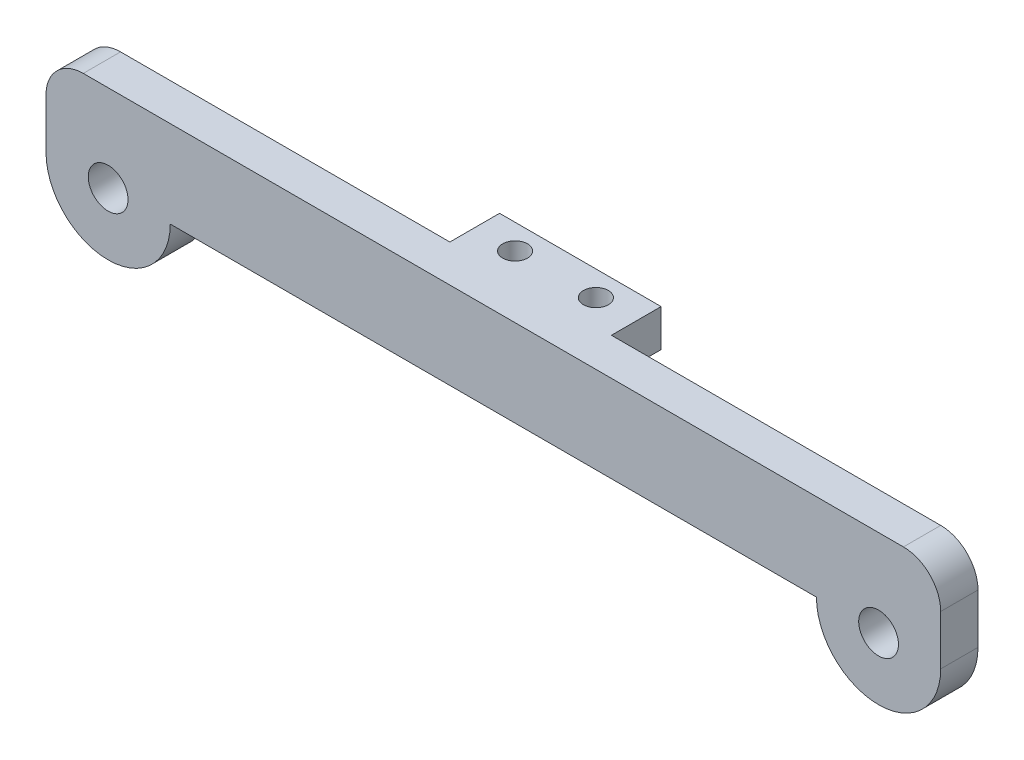
ISO-10303-21;
HEADER;
FILE_DESCRIPTION(('STEP AP214'),'2;1');
FILE_NAME('part.step','',(''),(''),'','','');
FILE_SCHEMA(('AUTOMOTIVE_DESIGN { 1 0 10303 214 1 1 1 1 }'));
ENDSEC;
DATA;
#1=APPLICATION_CONTEXT('core data for automotive mechanical design processes');
#2=APPLICATION_PROTOCOL_DEFINITION('international standard','automotive_design',2000,#1);
#3=PRODUCT_CONTEXT('',#1,'mechanical');
#4=PRODUCT('Part','Part','',(#3));
#5=PRODUCT_RELATED_PRODUCT_CATEGORY('part','',(#4));
#6=PRODUCT_DEFINITION_FORMATION('','',#4);
#7=PRODUCT_DEFINITION_CONTEXT('part definition',#1,'design');
#8=PRODUCT_DEFINITION('design','',#6,#7);
#9=PRODUCT_DEFINITION_SHAPE('','',#8);
#10=(LENGTH_UNIT() NAMED_UNIT(*) SI_UNIT(.MILLI.,.METRE.));
#11=(NAMED_UNIT(*) PLANE_ANGLE_UNIT() SI_UNIT($,.RADIAN.));
#12=(NAMED_UNIT(*) SI_UNIT($,.STERADIAN.) SOLID_ANGLE_UNIT());
#13=UNCERTAINTY_MEASURE_WITH_UNIT(LENGTH_MEASURE(1.E-05),#10,'distance_accuracy_value','');
#14=(GEOMETRIC_REPRESENTATION_CONTEXT(3) GLOBAL_UNCERTAINTY_ASSIGNED_CONTEXT((#13)) GLOBAL_UNIT_ASSIGNED_CONTEXT((#10,
#11,#12)) REPRESENTATION_CONTEXT('',''));
#15=CARTESIAN_POINT('',(0.,0.,0.));
#16=DIRECTION('',(0.,0.,1.));
#17=DIRECTION('',(1.,0.,0.));
#18=AXIS2_PLACEMENT_3D('',#15,#16,#17);
#19=CARTESIAN_POINT('',(-31.,0.,0.));
#20=DIRECTION('',(0.,0.,1.));
#21=DIRECTION('',(1.,0.,0.));
#22=AXIS2_PLACEMENT_3D('',#19,#20,#21);
#23=PLANE('',#22);
#24=CARTESIAN_POINT('',(31.,0.,0.));
#25=DIRECTION('',(0.,0.,1.));
#26=DIRECTION('',(1.,0.,0.));
#27=AXIS2_PLACEMENT_3D('',#24,#25,#26);
#28=CIRCLE('',#27,1.60000000000001);
#29=CARTESIAN_POINT('',(32.6,0.,0.));
#30=VERTEX_POINT('',#29);
#31=EDGE_CURVE('E186',#30,#30,#28,.T.);
#32=ORIENTED_EDGE('',*,*,#31,.T.);
#33=EDGE_LOOP('',(#32));
#34=FACE_BOUND('',#33,.T.);
#35=CARTESIAN_POINT('',(-31.,0.,0.));
#36=DIRECTION('',(0.,0.,1.));
#37=DIRECTION('',(1.,0.,0.));
#38=AXIS2_PLACEMENT_3D('',#35,#36,#37);
#39=CIRCLE('',#38,1.6);
#40=CARTESIAN_POINT('',(-29.4,0.,0.));
#41=VERTEX_POINT('',#40);
#42=EDGE_CURVE('E196',#41,#41,#39,.T.);
#43=ORIENTED_EDGE('',*,*,#42,.T.);
#44=EDGE_LOOP('',(#43));
#45=FACE_BOUND('',#44,.T.);
#46=DIRECTION('',(0.,-1.,0.));
#47=VECTOR('',#46,1.);
#48=CARTESIAN_POINT('',(-36.,0.,0.));
#49=LINE('',#48,#47);
#50=CARTESIAN_POINT('',(-36.,4.00000000000001,0.));
#51=VERTEX_POINT('',#50);
#52=CARTESIAN_POINT('',(-36.,0.,0.));
#53=VERTEX_POINT('',#52);
#54=EDGE_CURVE('E213',#51,#53,#49,.T.);
#55=ORIENTED_EDGE('',*,*,#54,.F.);
#56=CARTESIAN_POINT('',(-33.,4.00000000000001,0.));
#57=DIRECTION('',(0.,0.,1.));
#58=DIRECTION('',(1.,0.,0.));
#59=AXIS2_PLACEMENT_3D('',#56,#57,#58);
#60=CIRCLE('',#59,3.);
#61=CARTESIAN_POINT('',(-33.,7.00000000000001,0.));
#62=VERTEX_POINT('',#61);
#63=EDGE_CURVE('E269',#51,#62,#60,.F.);
#64=ORIENTED_EDGE('',*,*,#63,.T.);
#65=DIRECTION('',(-1.,0.,0.));
#66=VECTOR('',#65,1.);
#67=CARTESIAN_POINT('',(-36.,7.00000000000001,0.));
#68=LINE('',#67,#66);
#69=CARTESIAN_POINT('',(-6.5,7.00000000000002,0.));
#70=VERTEX_POINT('',#69);
#71=EDGE_CURVE('E241',#70,#62,#68,.T.);
#72=ORIENTED_EDGE('',*,*,#71,.F.);
#73=DIRECTION('',(0.,1.,0.));
#74=VECTOR('',#73,1.);
#75=CARTESIAN_POINT('',(-6.5,4.00000000000002,0.));
#76=LINE('',#75,#74);
#77=CARTESIAN_POINT('',(-6.5,4.00000000000002,0.));
#78=VERTEX_POINT('',#77);
#79=EDGE_CURVE('E187',#78,#70,#76,.T.);
#80=ORIENTED_EDGE('',*,*,#79,.F.);
#81=DIRECTION('',(1.,0.,0.));
#82=VECTOR('',#81,1.);
#83=CARTESIAN_POINT('',(-6.5,4.00000000000002,0.));
#84=LINE('',#83,#82);
#85=CARTESIAN_POINT('',(6.5,4.00000000000002,0.));
#86=VERTEX_POINT('',#85);
#87=EDGE_CURVE('E149',#78,#86,#84,.T.);
#88=ORIENTED_EDGE('',*,*,#87,.T.);
#89=DIRECTION('',(0.,1.,0.));
#90=VECTOR('',#89,1.);
#91=CARTESIAN_POINT('',(6.5,4.00000000000002,0.));
#92=LINE('',#91,#90);
#93=CARTESIAN_POINT('',(6.5,7.00000000000002,0.));
#94=VERTEX_POINT('',#93);
#95=EDGE_CURVE('E163',#86,#94,#92,.T.);
#96=ORIENTED_EDGE('',*,*,#95,.T.);
#97=CARTESIAN_POINT('',(33.,7.00000000000002,0.));
#98=VERTEX_POINT('',#97);
#99=EDGE_CURVE('E242',#98,#94,#68,.T.);
#100=ORIENTED_EDGE('',*,*,#99,.F.);
#101=CARTESIAN_POINT('',(33.,4.00000000000002,0.));
#102=DIRECTION('',(0.,0.,1.));
#103=DIRECTION('',(1.,0.,0.));
#104=AXIS2_PLACEMENT_3D('',#101,#102,#103);
#105=CIRCLE('',#104,3.);
#106=CARTESIAN_POINT('',(36.,4.00000000000002,0.));
#107=VERTEX_POINT('',#106);
#108=EDGE_CURVE('E266',#98,#107,#105,.F.);
#109=ORIENTED_EDGE('',*,*,#108,.T.);
#110=DIRECTION('',(0.,1.,0.));
#111=VECTOR('',#110,1.);
#112=CARTESIAN_POINT('',(36.,7.00000000000002,0.));
#113=LINE('',#112,#111);
#114=CARTESIAN_POINT('',(36.,0.,0.));
#115=VERTEX_POINT('',#114);
#116=EDGE_CURVE('E238',#115,#107,#113,.T.);
#117=ORIENTED_EDGE('',*,*,#116,.F.);
#118=CARTESIAN_POINT('',(31.,0.,0.));
#119=DIRECTION('',(0.,0.,1.));
#120=DIRECTION('',(1.,0.,0.));
#121=AXIS2_PLACEMENT_3D('',#118,#119,#120);
#122=CIRCLE('',#121,5.);
#123=CARTESIAN_POINT('',(26.,0.,0.));
#124=VERTEX_POINT('',#123);
#125=EDGE_CURVE('E235',#124,#115,#122,.T.);
#126=ORIENTED_EDGE('',*,*,#125,.F.);
#127=DIRECTION('',(1.,0.,0.));
#128=VECTOR('',#127,1.);
#129=CARTESIAN_POINT('',(-26.,0.,0.));
#130=LINE('',#129,#128);
#131=CARTESIAN_POINT('',(-26.,0.,0.));
#132=VERTEX_POINT('',#131);
#133=EDGE_CURVE('E232',#132,#124,#130,.T.);
#134=ORIENTED_EDGE('',*,*,#133,.F.);
#135=CARTESIAN_POINT('',(-31.,0.,0.));
#136=DIRECTION('',(0.,0.,1.));
#137=DIRECTION('',(1.,0.,0.));
#138=AXIS2_PLACEMENT_3D('',#135,#136,#137);
#139=CIRCLE('',#138,5.);
#140=EDGE_CURVE('E204',#53,#132,#139,.T.);
#141=ORIENTED_EDGE('',*,*,#140,.F.);
#142=EDGE_LOOP('',(#55,#64,#72,#80,#88,#96,#100,#109,#117,#126,#134,#141));
#143=FACE_BOUND('',#142,.T.);
#144=ADVANCED_FACE('F45',(#34,#45,#143),#23,.F.);
#145=CARTESIAN_POINT('',(-31.,0.,3.));
#146=DIRECTION('',(0.,0.,1.));
#147=DIRECTION('',(1.,0.,0.));
#148=AXIS2_PLACEMENT_3D('',#145,#146,#147);
#149=PLANE('',#148);
#150=CARTESIAN_POINT('',(-31.,0.,3.));
#151=DIRECTION('',(0.,0.,1.));
#152=DIRECTION('',(1.,0.,0.));
#153=AXIS2_PLACEMENT_3D('',#150,#151,#152);
#154=CIRCLE('',#153,1.6);
#155=CARTESIAN_POINT('',(-29.4,0.,3.));
#156=VERTEX_POINT('',#155);
#157=EDGE_CURVE('E200',#156,#156,#154,.T.);
#158=ORIENTED_EDGE('',*,*,#157,.F.);
#159=EDGE_LOOP('',(#158));
#160=FACE_BOUND('',#159,.T.);
#161=DIRECTION('',(-1.,0.,0.));
#162=VECTOR('',#161,1.);
#163=CARTESIAN_POINT('',(-36.,7.00000000000001,3.));
#164=LINE('',#163,#162);
#165=CARTESIAN_POINT('',(33.,7.00000000000002,3.));
#166=VERTEX_POINT('',#165);
#167=CARTESIAN_POINT('',(-33.,7.00000000000001,3.));
#168=VERTEX_POINT('',#167);
#169=EDGE_CURVE('E222',#166,#168,#164,.T.);
#170=ORIENTED_EDGE('',*,*,#169,.T.);
#171=CARTESIAN_POINT('',(-33.,4.00000000000001,3.));
#172=DIRECTION('',(0.,0.,1.));
#173=DIRECTION('',(1.,0.,0.));
#174=AXIS2_PLACEMENT_3D('',#171,#172,#173);
#175=CIRCLE('',#174,3.);
#176=CARTESIAN_POINT('',(-36.,4.00000000000001,3.));
#177=VERTEX_POINT('',#176);
#178=EDGE_CURVE('E54',#168,#177,#175,.T.);
#179=ORIENTED_EDGE('',*,*,#178,.T.);
#180=DIRECTION('',(0.,-1.,0.));
#181=VECTOR('',#180,1.);
#182=CARTESIAN_POINT('',(-36.,0.,3.));
#183=LINE('',#182,#181);
#184=CARTESIAN_POINT('',(-36.,0.,3.));
#185=VERTEX_POINT('',#184);
#186=EDGE_CURVE('E225',#177,#185,#183,.T.);
#187=ORIENTED_EDGE('',*,*,#186,.T.);
#188=CARTESIAN_POINT('',(-31.,0.,3.));
#189=DIRECTION('',(0.,0.,1.));
#190=DIRECTION('',(1.,0.,0.));
#191=AXIS2_PLACEMENT_3D('',#188,#189,#190);
#192=CIRCLE('',#191,5.);
#193=CARTESIAN_POINT('',(-26.,0.,3.));
#194=VERTEX_POINT('',#193);
#195=EDGE_CURVE('E208',#185,#194,#192,.T.);
#196=ORIENTED_EDGE('',*,*,#195,.T.);
#197=DIRECTION('',(1.,0.,0.));
#198=VECTOR('',#197,1.);
#199=CARTESIAN_POINT('',(-26.,0.,3.));
#200=LINE('',#199,#198);
#201=CARTESIAN_POINT('',(26.,0.,3.));
#202=VERTEX_POINT('',#201);
#203=EDGE_CURVE('E212',#194,#202,#200,.T.);
#204=ORIENTED_EDGE('',*,*,#203,.T.);
#205=CARTESIAN_POINT('',(31.,0.,3.));
#206=DIRECTION('',(0.,0.,1.));
#207=DIRECTION('',(1.,0.,0.));
#208=AXIS2_PLACEMENT_3D('',#205,#206,#207);
#209=CIRCLE('',#208,5.);
#210=CARTESIAN_POINT('',(36.,0.,3.));
#211=VERTEX_POINT('',#210);
#212=EDGE_CURVE('E216',#202,#211,#209,.T.);
#213=ORIENTED_EDGE('',*,*,#212,.T.);
#214=DIRECTION('',(0.,1.,0.));
#215=VECTOR('',#214,1.);
#216=CARTESIAN_POINT('',(36.,7.00000000000002,3.));
#217=LINE('',#216,#215);
#218=CARTESIAN_POINT('',(36.,4.00000000000002,3.));
#219=VERTEX_POINT('',#218);
#220=EDGE_CURVE('E219',#211,#219,#217,.T.);
#221=ORIENTED_EDGE('',*,*,#220,.T.);
#222=CARTESIAN_POINT('',(33.,4.00000000000002,3.));
#223=DIRECTION('',(0.,0.,1.));
#224=DIRECTION('',(1.,0.,0.));
#225=AXIS2_PLACEMENT_3D('',#222,#223,#224);
#226=CIRCLE('',#225,3.);
#227=EDGE_CURVE('E278',#219,#166,#226,.T.);
#228=ORIENTED_EDGE('',*,*,#227,.T.);
#229=EDGE_LOOP('',(#170,#179,#187,#196,#204,#213,#221,#228));
#230=FACE_BOUND('',#229,.T.);
#231=CARTESIAN_POINT('',(31.,0.,3.));
#232=DIRECTION('',(0.,0.,1.));
#233=DIRECTION('',(1.,0.,0.));
#234=AXIS2_PLACEMENT_3D('',#231,#232,#233);
#235=CIRCLE('',#234,1.60000000000001);
#236=CARTESIAN_POINT('',(32.6,0.,3.));
#237=VERTEX_POINT('',#236);
#238=EDGE_CURVE('E192',#237,#237,#235,.T.);
#239=ORIENTED_EDGE('',*,*,#238,.F.);
#240=EDGE_LOOP('',(#239));
#241=FACE_BOUND('',#240,.T.);
#242=ADVANCED_FACE('F284',(#160,#230,#241),#149,.T.);
#243=CARTESIAN_POINT('',(-31.,0.,3.));
#244=DIRECTION('',(0.,0.,-1.));
#245=DIRECTION('',(-1.,0.,0.));
#246=AXIS2_PLACEMENT_3D('',#243,#244,#245);
#247=CYLINDRICAL_SURFACE('',#246,5.);
#248=ORIENTED_EDGE('',*,*,#140,.T.);
#249=DIRECTION('',(0.,0.,-1.));
#250=VECTOR('',#249,1.);
#251=CARTESIAN_POINT('',(-26.,0.,3.));
#252=LINE('',#251,#250);
#253=EDGE_CURVE('E258',#194,#132,#252,.T.);
#254=ORIENTED_EDGE('',*,*,#253,.F.);
#255=ORIENTED_EDGE('',*,*,#195,.F.);
#256=DIRECTION('',(0.,0.,-1.));
#257=VECTOR('',#256,1.);
#258=CARTESIAN_POINT('',(-36.,0.,3.));
#259=LINE('',#258,#257);
#260=EDGE_CURVE('E228',#185,#53,#259,.T.);
#261=ORIENTED_EDGE('',*,*,#260,.T.);
#262=EDGE_LOOP('',(#248,#254,#255,#261));
#263=FACE_BOUND('',#262,.T.);
#264=ADVANCED_FACE('F320',(#263),#247,.T.);
#265=CARTESIAN_POINT('',(-26.,0.,3.));
#266=DIRECTION('',(0.,1.,0.));
#267=DIRECTION('',(-1.,0.,0.));
#268=AXIS2_PLACEMENT_3D('',#265,#266,#267);
#269=PLANE('',#268);
#270=ORIENTED_EDGE('',*,*,#133,.T.);
#271=DIRECTION('',(0.,0.,-1.));
#272=VECTOR('',#271,1.);
#273=CARTESIAN_POINT('',(26.,0.,3.));
#274=LINE('',#273,#272);
#275=EDGE_CURVE('E254',#202,#124,#274,.T.);
#276=ORIENTED_EDGE('',*,*,#275,.F.);
#277=ORIENTED_EDGE('',*,*,#203,.F.);
#278=ORIENTED_EDGE('',*,*,#253,.T.);
#279=EDGE_LOOP('',(#270,#276,#277,#278));
#280=FACE_BOUND('',#279,.T.);
#281=ADVANCED_FACE('F317',(#280),#269,.F.);
#282=CARTESIAN_POINT('',(31.,0.,3.));
#283=DIRECTION('',(0.,0.,-1.));
#284=DIRECTION('',(-1.,0.,0.));
#285=AXIS2_PLACEMENT_3D('',#282,#283,#284);
#286=CYLINDRICAL_SURFACE('',#285,5.);
#287=ORIENTED_EDGE('',*,*,#125,.T.);
#288=DIRECTION('',(0.,0.,-1.));
#289=VECTOR('',#288,1.);
#290=CARTESIAN_POINT('',(36.,0.,3.));
#291=LINE('',#290,#289);
#292=EDGE_CURVE('E250',#211,#115,#291,.T.);
#293=ORIENTED_EDGE('',*,*,#292,.F.);
#294=ORIENTED_EDGE('',*,*,#212,.F.);
#295=ORIENTED_EDGE('',*,*,#275,.T.);
#296=EDGE_LOOP('',(#287,#293,#294,#295));
#297=FACE_BOUND('',#296,.T.);
#298=ADVANCED_FACE('F314',(#297),#286,.T.);
#299=CARTESIAN_POINT('',(36.,7.00000000000002,3.));
#300=DIRECTION('',(-1.,0.,0.));
#301=DIRECTION('',(0.,0.,1.));
#302=AXIS2_PLACEMENT_3D('',#299,#300,#301);
#303=PLANE('',#302);
#304=ORIENTED_EDGE('',*,*,#116,.T.);
#305=DIRECTION('',(0.,0.,-1.));
#306=VECTOR('',#305,1.);
#307=CARTESIAN_POINT('',(36.,4.00000000000002,3.));
#308=LINE('',#307,#306);
#309=EDGE_CURVE('E11',#107,#219,#308,.F.);
#310=ORIENTED_EDGE('',*,*,#309,.T.);
#311=ORIENTED_EDGE('',*,*,#220,.F.);
#312=ORIENTED_EDGE('',*,*,#292,.T.);
#313=EDGE_LOOP('',(#304,#310,#311,#312));
#314=FACE_BOUND('',#313,.T.);
#315=ADVANCED_FACE('F311',(#314),#303,.F.);
#316=CARTESIAN_POINT('',(-36.,7.00000000000001,3.));
#317=DIRECTION('',(0.,-1.,0.));
#318=DIRECTION('',(1.,0.,0.));
#319=AXIS2_PLACEMENT_3D('',#316,#317,#318);
#320=PLANE('',#319);
#321=ORIENTED_EDGE('',*,*,#71,.T.);
#322=DIRECTION('',(0.,0.,-1.));
#323=VECTOR('',#322,1.);
#324=CARTESIAN_POINT('',(-33.,7.00000000000001,3.));
#325=LINE('',#324,#323);
#326=EDGE_CURVE('E67',#62,#168,#325,.F.);
#327=ORIENTED_EDGE('',*,*,#326,.T.);
#328=ORIENTED_EDGE('',*,*,#169,.F.);
#329=DIRECTION('',(0.,0.,-1.));
#330=VECTOR('',#329,1.);
#331=CARTESIAN_POINT('',(33.,7.00000000000002,3.));
#332=LINE('',#331,#330);
#333=EDGE_CURVE('E272',#166,#98,#332,.T.);
#334=ORIENTED_EDGE('',*,*,#333,.T.);
#335=ORIENTED_EDGE('',*,*,#99,.T.);
#336=DIRECTION('',(0.,0.,-1.));
#337=VECTOR('',#336,1.);
#338=CARTESIAN_POINT('',(6.5,7.00000000000002,-4.));
#339=LINE('',#338,#337);
#340=CARTESIAN_POINT('',(6.5,7.00000000000002,-4.));
#341=VERTEX_POINT('',#340);
#342=EDGE_CURVE('E178',#94,#341,#339,.T.);
#343=ORIENTED_EDGE('',*,*,#342,.T.);
#344=DIRECTION('',(-1.,0.,0.));
#345=VECTOR('',#344,1.);
#346=CARTESIAN_POINT('',(-6.5,7.00000000000002,-4.));
#347=LINE('',#346,#345);
#348=CARTESIAN_POINT('',(-6.5,7.00000000000002,-4.));
#349=VERTEX_POINT('',#348);
#350=EDGE_CURVE('E142',#341,#349,#347,.T.);
#351=ORIENTED_EDGE('',*,*,#350,.T.);
#352=DIRECTION('',(0.,0.,1.));
#353=VECTOR('',#352,1.);
#354=CARTESIAN_POINT('',(-6.5,7.00000000000002,-4.));
#355=LINE('',#354,#353);
#356=EDGE_CURVE('E165',#349,#70,#355,.T.);
#357=ORIENTED_EDGE('',*,*,#356,.T.);
#358=EDGE_LOOP('',(#321,#327,#328,#334,#335,#343,#351,#357));
#359=FACE_BOUND('',#358,.T.);
#360=CARTESIAN_POINT('',(3.25,7.00000000000002,-2.));
#361=DIRECTION('',(0.,1.,0.));
#362=DIRECTION('',(-1.,0.,0.));
#363=AXIS2_PLACEMENT_3D('',#360,#361,#362);
#364=CIRCLE('',#363,1.);
#365=CARTESIAN_POINT('',(2.25,7.00000000000002,-2.));
#366=VERTEX_POINT('',#365);
#367=EDGE_CURVE('E484',#366,#366,#364,.T.);
#368=ORIENTED_EDGE('',*,*,#367,.F.);
#369=EDGE_LOOP('',(#368));
#370=FACE_BOUND('',#369,.T.);
#371=CARTESIAN_POINT('',(-3.25,7.00000000000002,-2.));
#372=DIRECTION('',(0.,1.,0.));
#373=DIRECTION('',(-1.,0.,0.));
#374=AXIS2_PLACEMENT_3D('',#371,#372,#373);
#375=CIRCLE('',#374,1.);
#376=CARTESIAN_POINT('',(-4.25,7.00000000000002,-2.));
#377=VERTEX_POINT('',#376);
#378=EDGE_CURVE('E171',#377,#377,#375,.T.);
#379=ORIENTED_EDGE('',*,*,#378,.F.);
#380=EDGE_LOOP('',(#379));
#381=FACE_BOUND('',#380,.T.);
#382=ADVANCED_FACE('F298',(#359,#370,#381),#320,.F.);
#383=CARTESIAN_POINT('',(-36.,0.,3.));
#384=DIRECTION('',(1.,0.,0.));
#385=DIRECTION('',(0.,0.,-1.));
#386=AXIS2_PLACEMENT_3D('',#383,#384,#385);
#387=PLANE('',#386);
#388=ORIENTED_EDGE('',*,*,#186,.F.);
#389=DIRECTION('',(0.,0.,-1.));
#390=VECTOR('',#389,1.);
#391=CARTESIAN_POINT('',(-36.,4.00000000000001,3.));
#392=LINE('',#391,#390);
#393=EDGE_CURVE('E262',#177,#51,#392,.T.);
#394=ORIENTED_EDGE('',*,*,#393,.T.);
#395=ORIENTED_EDGE('',*,*,#54,.T.);
#396=ORIENTED_EDGE('',*,*,#260,.F.);
#397=EDGE_LOOP('',(#388,#394,#395,#396));
#398=FACE_BOUND('',#397,.T.);
#399=ADVANCED_FACE('F290',(#398),#387,.F.);
#400=CARTESIAN_POINT('',(-31.,0.,3.));
#401=DIRECTION('',(0.,0.,-1.));
#402=DIRECTION('',(-1.,0.,0.));
#403=AXIS2_PLACEMENT_3D('',#400,#401,#402);
#404=CYLINDRICAL_SURFACE('',#403,1.6);
#405=ORIENTED_EDGE('',*,*,#157,.T.);
#406=EDGE_LOOP('',(#405));
#407=FACE_BOUND('',#406,.T.);
#408=ORIENTED_EDGE('',*,*,#42,.F.);
#409=EDGE_LOOP('',(#408));
#410=FACE_BOUND('',#409,.T.);
#411=ADVANCED_FACE('F341',(#407,#410),#404,.F.);
#412=CARTESIAN_POINT('',(31.,0.,3.));
#413=DIRECTION('',(0.,0.,-1.));
#414=DIRECTION('',(-1.,0.,0.));
#415=AXIS2_PLACEMENT_3D('',#412,#413,#414);
#416=CYLINDRICAL_SURFACE('',#415,1.60000000000001);
#417=ORIENTED_EDGE('',*,*,#238,.T.);
#418=EDGE_LOOP('',(#417));
#419=FACE_BOUND('',#418,.T.);
#420=ORIENTED_EDGE('',*,*,#31,.F.);
#421=EDGE_LOOP('',(#420));
#422=FACE_BOUND('',#421,.T.);
#423=ADVANCED_FACE('F359',(#419,#422),#416,.F.);
#424=CARTESIAN_POINT('',(6.5,4.00000000000002,-4.));
#425=DIRECTION('',(1.,0.,0.));
#426=DIRECTION('',(0.,0.,-1.));
#427=AXIS2_PLACEMENT_3D('',#424,#425,#426);
#428=PLANE('',#427);
#429=ORIENTED_EDGE('',*,*,#342,.F.);
#430=ORIENTED_EDGE('',*,*,#95,.F.);
#431=DIRECTION('',(0.,0.,-1.));
#432=VECTOR('',#431,1.);
#433=CARTESIAN_POINT('',(6.5,4.00000000000002,-4.));
#434=LINE('',#433,#432);
#435=CARTESIAN_POINT('',(6.5,4.00000000000002,-4.));
#436=VERTEX_POINT('',#435);
#437=EDGE_CURVE('E156',#86,#436,#434,.T.);
#438=ORIENTED_EDGE('',*,*,#437,.T.);
#439=DIRECTION('',(0.,1.,0.));
#440=VECTOR('',#439,1.);
#441=CARTESIAN_POINT('',(6.5,4.00000000000002,-4.));
#442=LINE('',#441,#440);
#443=EDGE_CURVE('E137',#436,#341,#442,.T.);
#444=ORIENTED_EDGE('',*,*,#443,.T.);
#445=EDGE_LOOP('',(#429,#430,#438,#444));
#446=FACE_BOUND('',#445,.T.);
#447=ADVANCED_FACE('F161',(#446),#428,.T.);
#448=CARTESIAN_POINT('',(-6.5,4.00000000000002,-4.));
#449=DIRECTION('',(-1.,0.,0.));
#450=DIRECTION('',(0.,0.,1.));
#451=AXIS2_PLACEMENT_3D('',#448,#449,#450);
#452=PLANE('',#451);
#453=ORIENTED_EDGE('',*,*,#356,.F.);
#454=DIRECTION('',(0.,1.,0.));
#455=VECTOR('',#454,1.);
#456=CARTESIAN_POINT('',(-6.5,4.00000000000002,-4.));
#457=LINE('',#456,#455);
#458=CARTESIAN_POINT('',(-6.5,4.00000000000002,-4.));
#459=VERTEX_POINT('',#458);
#460=EDGE_CURVE('E148',#459,#349,#457,.T.);
#461=ORIENTED_EDGE('',*,*,#460,.F.);
#462=DIRECTION('',(0.,0.,1.));
#463=VECTOR('',#462,1.);
#464=CARTESIAN_POINT('',(-6.5,4.00000000000002,-4.));
#465=LINE('',#464,#463);
#466=EDGE_CURVE('E158',#459,#78,#465,.T.);
#467=ORIENTED_EDGE('',*,*,#466,.T.);
#468=ORIENTED_EDGE('',*,*,#79,.T.);
#469=EDGE_LOOP('',(#453,#461,#467,#468));
#470=FACE_BOUND('',#469,.T.);
#471=ADVANCED_FACE('F303',(#470),#452,.T.);
#472=CARTESIAN_POINT('',(-6.5,4.00000000000002,-4.));
#473=DIRECTION('',(0.,0.,-1.));
#474=DIRECTION('',(-1.,0.,0.));
#475=AXIS2_PLACEMENT_3D('',#472,#473,#474);
#476=PLANE('',#475);
#477=ORIENTED_EDGE('',*,*,#350,.F.);
#478=ORIENTED_EDGE('',*,*,#443,.F.);
#479=DIRECTION('',(-1.,0.,0.));
#480=VECTOR('',#479,1.);
#481=CARTESIAN_POINT('',(-6.5,4.00000000000002,-4.));
#482=LINE('',#481,#480);
#483=EDGE_CURVE('E140',#436,#459,#482,.T.);
#484=ORIENTED_EDGE('',*,*,#483,.T.);
#485=ORIENTED_EDGE('',*,*,#460,.T.);
#486=EDGE_LOOP('',(#477,#478,#484,#485));
#487=FACE_BOUND('',#486,.T.);
#488=ADVANCED_FACE('F139',(#487),#476,.T.);
#489=CARTESIAN_POINT('',(0.,4.00000000000002,0.));
#490=DIRECTION('',(0.,1.,0.));
#491=DIRECTION('',(-1.,0.,0.));
#492=AXIS2_PLACEMENT_3D('',#489,#490,#491);
#493=PLANE('',#492);
#494=CARTESIAN_POINT('',(3.25,4.00000000000002,-2.));
#495=DIRECTION('',(0.,1.,0.));
#496=DIRECTION('',(-1.,0.,0.));
#497=AXIS2_PLACEMENT_3D('',#494,#495,#496);
#498=CIRCLE('',#497,1.);
#499=CARTESIAN_POINT('',(2.25,4.00000000000002,-2.));
#500=VERTEX_POINT('',#499);
#501=EDGE_CURVE('E481',#500,#500,#498,.T.);
#502=ORIENTED_EDGE('',*,*,#501,.T.);
#503=EDGE_LOOP('',(#502));
#504=FACE_BOUND('',#503,.T.);
#505=CARTESIAN_POINT('',(-3.25,4.00000000000002,-2.));
#506=DIRECTION('',(0.,1.,0.));
#507=DIRECTION('',(-1.,0.,0.));
#508=AXIS2_PLACEMENT_3D('',#505,#506,#507);
#509=CIRCLE('',#508,1.);
#510=CARTESIAN_POINT('',(-4.25,4.00000000000002,-2.));
#511=VERTEX_POINT('',#510);
#512=EDGE_CURVE('E181',#511,#511,#509,.T.);
#513=ORIENTED_EDGE('',*,*,#512,.T.);
#514=EDGE_LOOP('',(#513));
#515=FACE_BOUND('',#514,.T.);
#516=ORIENTED_EDGE('',*,*,#437,.F.);
#517=ORIENTED_EDGE('',*,*,#87,.F.);
#518=ORIENTED_EDGE('',*,*,#466,.F.);
#519=ORIENTED_EDGE('',*,*,#483,.F.);
#520=EDGE_LOOP('',(#516,#517,#518,#519));
#521=FACE_BOUND('',#520,.T.);
#522=ADVANCED_FACE('F154',(#504,#515,#521),#493,.F.);
#523=CARTESIAN_POINT('',(-3.25,4.00000000000002,-2.));
#524=DIRECTION('',(0.,1.,0.));
#525=DIRECTION('',(-1.,0.,0.));
#526=AXIS2_PLACEMENT_3D('',#523,#524,#525);
#527=CYLINDRICAL_SURFACE('',#526,1.);
#528=ORIENTED_EDGE('',*,*,#512,.F.);
#529=EDGE_LOOP('',(#528));
#530=FACE_BOUND('',#529,.T.);
#531=ORIENTED_EDGE('',*,*,#378,.T.);
#532=EDGE_LOOP('',(#531));
#533=FACE_BOUND('',#532,.T.);
#534=ADVANCED_FACE('F399',(#530,#533),#527,.F.);
#535=CARTESIAN_POINT('',(3.25,4.00000000000002,-2.));
#536=DIRECTION('',(0.,1.,0.));
#537=DIRECTION('',(-1.,0.,0.));
#538=AXIS2_PLACEMENT_3D('',#535,#536,#537);
#539=CYLINDRICAL_SURFACE('',#538,1.);
#540=ORIENTED_EDGE('',*,*,#501,.F.);
#541=EDGE_LOOP('',(#540));
#542=FACE_BOUND('',#541,.T.);
#543=ORIENTED_EDGE('',*,*,#367,.T.);
#544=EDGE_LOOP('',(#543));
#545=FACE_BOUND('',#544,.T.);
#546=ADVANCED_FACE('F407',(#542,#545),#539,.F.);
#547=CARTESIAN_POINT('',(-33.,4.00000000000001,3.));
#548=DIRECTION('',(0.,0.,-1.));
#549=DIRECTION('',(-1.,0.,0.));
#550=AXIS2_PLACEMENT_3D('',#547,#548,#549);
#551=CYLINDRICAL_SURFACE('',#550,3.);
#552=ORIENTED_EDGE('',*,*,#178,.F.);
#553=ORIENTED_EDGE('',*,*,#326,.F.);
#554=ORIENTED_EDGE('',*,*,#63,.F.);
#555=ORIENTED_EDGE('',*,*,#393,.F.);
#556=EDGE_LOOP('',(#552,#553,#554,#555));
#557=FACE_BOUND('',#556,.T.);
#558=ADVANCED_FACE('F293',(#557),#551,.T.);
#559=CARTESIAN_POINT('',(33.,4.00000000000002,3.));
#560=DIRECTION('',(0.,0.,-1.));
#561=DIRECTION('',(-1.,0.,0.));
#562=AXIS2_PLACEMENT_3D('',#559,#560,#561);
#563=CYLINDRICAL_SURFACE('',#562,3.);
#564=ORIENTED_EDGE('',*,*,#227,.F.);
#565=ORIENTED_EDGE('',*,*,#309,.F.);
#566=ORIENTED_EDGE('',*,*,#108,.F.);
#567=ORIENTED_EDGE('',*,*,#333,.F.);
#568=EDGE_LOOP('',(#564,#565,#566,#567));
#569=FACE_BOUND('',#568,.T.);
#570=ADVANCED_FACE('F47',(#569),#563,.T.);
#571=CLOSED_SHELL('',(#144,#242,#264,#281,#298,#315,#382,#399,#411,#423,#447,#471,#488,#522,
#534,#546,#558,#570));
#572=MANIFOLD_SOLID_BREP('B2',#571);
#573=ADVANCED_BREP_SHAPE_REPRESENTATION('',(#18,#572),#14);
#574=SHAPE_DEFINITION_REPRESENTATION(#9,#573);
ENDSEC;
END-ISO-10303-21;
